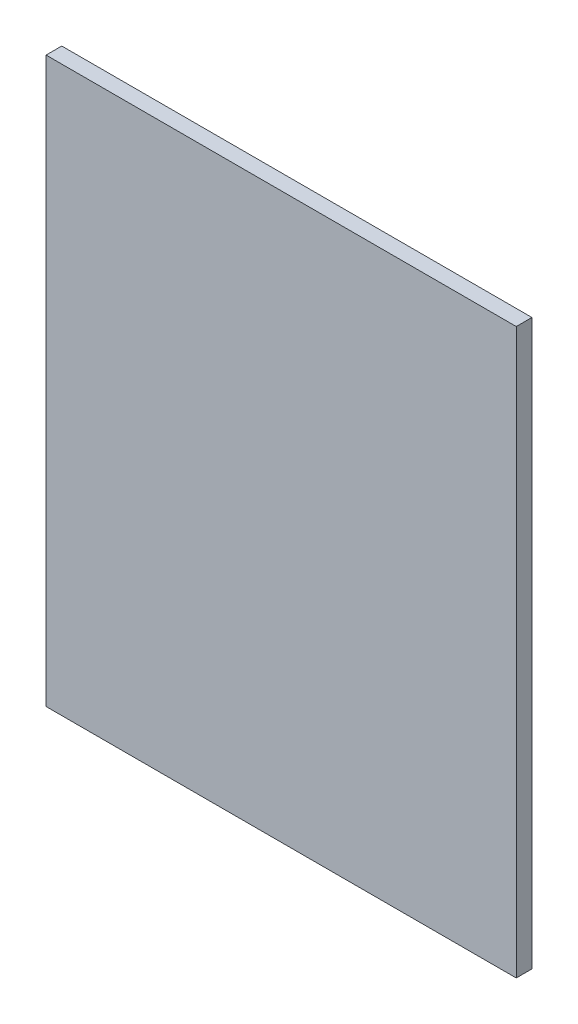
ISO-10303-21;
HEADER;
FILE_DESCRIPTION(('STEP AP214'),'2;1');
FILE_NAME('part.step','',(''),(''),'','','');
FILE_SCHEMA(('AUTOMOTIVE_DESIGN { 1 0 10303 214 1 1 1 1 }'));
ENDSEC;
DATA;
#1=APPLICATION_CONTEXT('core data for automotive mechanical design processes');
#2=APPLICATION_PROTOCOL_DEFINITION('international standard','automotive_design',2000,#1);
#3=PRODUCT_CONTEXT('',#1,'mechanical');
#4=PRODUCT('Part','Part','',(#3));
#5=PRODUCT_RELATED_PRODUCT_CATEGORY('part','',(#4));
#6=PRODUCT_DEFINITION_FORMATION('','',#4);
#7=PRODUCT_DEFINITION_CONTEXT('part definition',#1,'design');
#8=PRODUCT_DEFINITION('design','',#6,#7);
#9=PRODUCT_DEFINITION_SHAPE('','',#8);
#10=(LENGTH_UNIT() NAMED_UNIT(*) SI_UNIT(.MILLI.,.METRE.));
#11=(NAMED_UNIT(*) PLANE_ANGLE_UNIT() SI_UNIT($,.RADIAN.));
#12=(NAMED_UNIT(*) SI_UNIT($,.STERADIAN.) SOLID_ANGLE_UNIT());
#13=UNCERTAINTY_MEASURE_WITH_UNIT(LENGTH_MEASURE(1.E-05),#10,'distance_accuracy_value','');
#14=(GEOMETRIC_REPRESENTATION_CONTEXT(3) GLOBAL_UNCERTAINTY_ASSIGNED_CONTEXT((#13)) GLOBAL_UNIT_ASSIGNED_CONTEXT((#10,
#11,#12)) REPRESENTATION_CONTEXT('',''));
#15=CARTESIAN_POINT('',(0.,0.,0.));
#16=DIRECTION('',(0.,0.,1.));
#17=DIRECTION('',(1.,0.,0.));
#18=AXIS2_PLACEMENT_3D('',#15,#16,#17);
#19=CARTESIAN_POINT('',(150.,-180.,10.));
#20=DIRECTION('',(-1.,0.,0.));
#21=DIRECTION('',(0.,0.,1.));
#22=AXIS2_PLACEMENT_3D('',#19,#20,#21);
#23=PLANE('',#22);
#24=DIRECTION('',(0.,1.,0.));
#25=VECTOR('',#24,1.);
#26=CARTESIAN_POINT('',(150.,-180.,0.));
#27=LINE('',#26,#25);
#28=CARTESIAN_POINT('',(150.,-180.,0.));
#29=VERTEX_POINT('',#28);
#30=CARTESIAN_POINT('',(150.,180.,0.));
#31=VERTEX_POINT('',#30);
#32=EDGE_CURVE('E96',#29,#31,#27,.T.);
#33=ORIENTED_EDGE('',*,*,#32,.T.);
#34=DIRECTION('',(0.,0.,-1.));
#35=VECTOR('',#34,1.);
#36=CARTESIAN_POINT('',(150.,180.,10.));
#37=LINE('',#36,#35);
#38=CARTESIAN_POINT('',(150.,180.,10.));
#39=VERTEX_POINT('',#38);
#40=EDGE_CURVE('E11',#39,#31,#37,.T.);
#41=ORIENTED_EDGE('',*,*,#40,.F.);
#42=DIRECTION('',(0.,1.,0.));
#43=VECTOR('',#42,1.);
#44=CARTESIAN_POINT('',(150.,-180.,10.));
#45=LINE('',#44,#43);
#46=CARTESIAN_POINT('',(150.,-180.,10.));
#47=VERTEX_POINT('',#46);
#48=EDGE_CURVE('E84',#47,#39,#45,.T.);
#49=ORIENTED_EDGE('',*,*,#48,.F.);
#50=DIRECTION('',(0.,0.,-1.));
#51=VECTOR('',#50,1.);
#52=CARTESIAN_POINT('',(150.,-180.,10.));
#53=LINE('',#52,#51);
#54=EDGE_CURVE('E92',#47,#29,#53,.T.);
#55=ORIENTED_EDGE('',*,*,#54,.T.);
#56=EDGE_LOOP('',(#33,#41,#49,#55));
#57=FACE_BOUND('',#56,.T.);
#58=ADVANCED_FACE('F33',(#57),#23,.F.);
#59=CARTESIAN_POINT('',(-150.,180.,10.));
#60=DIRECTION('',(0.,-1.,0.));
#61=DIRECTION('',(0.,0.,-1.));
#62=AXIS2_PLACEMENT_3D('',#59,#60,#61);
#63=PLANE('',#62);
#64=DIRECTION('',(-1.,0.,0.));
#65=VECTOR('',#64,1.);
#66=CARTESIAN_POINT('',(-150.,180.,0.));
#67=LINE('',#66,#65);
#68=CARTESIAN_POINT('',(-150.,180.,0.));
#69=VERTEX_POINT('',#68);
#70=EDGE_CURVE('E88',#31,#69,#67,.T.);
#71=ORIENTED_EDGE('',*,*,#70,.T.);
#72=DIRECTION('',(0.,0.,-1.));
#73=VECTOR('',#72,1.);
#74=CARTESIAN_POINT('',(-150.,180.,10.));
#75=LINE('',#74,#73);
#76=CARTESIAN_POINT('',(-150.,180.,10.));
#77=VERTEX_POINT('',#76);
#78=EDGE_CURVE('E41',#77,#69,#75,.T.);
#79=ORIENTED_EDGE('',*,*,#78,.F.);
#80=DIRECTION('',(-1.,0.,0.));
#81=VECTOR('',#80,1.);
#82=CARTESIAN_POINT('',(-150.,180.,10.));
#83=LINE('',#82,#81);
#84=EDGE_CURVE('E79',#39,#77,#83,.T.);
#85=ORIENTED_EDGE('',*,*,#84,.F.);
#86=ORIENTED_EDGE('',*,*,#40,.T.);
#87=EDGE_LOOP('',(#71,#79,#85,#86));
#88=FACE_BOUND('',#87,.T.);
#89=ADVANCED_FACE('F87',(#88),#63,.F.);
#90=CARTESIAN_POINT('',(-150.,-180.,10.));
#91=DIRECTION('',(1.,0.,0.));
#92=DIRECTION('',(0.,0.,-1.));
#93=AXIS2_PLACEMENT_3D('',#90,#91,#92);
#94=PLANE('',#93);
#95=DIRECTION('',(0.,-1.,0.));
#96=VECTOR('',#95,1.);
#97=CARTESIAN_POINT('',(-150.,-180.,0.));
#98=LINE('',#97,#96);
#99=CARTESIAN_POINT('',(-150.,-180.,0.));
#100=VERTEX_POINT('',#99);
#101=EDGE_CURVE('E66',#69,#100,#98,.T.);
#102=ORIENTED_EDGE('',*,*,#101,.T.);
#103=DIRECTION('',(0.,0.,-1.));
#104=VECTOR('',#103,1.);
#105=CARTESIAN_POINT('',(-150.,-180.,10.));
#106=LINE('',#105,#104);
#107=CARTESIAN_POINT('',(-150.,-180.,10.));
#108=VERTEX_POINT('',#107);
#109=EDGE_CURVE('E89',#108,#100,#106,.T.);
#110=ORIENTED_EDGE('',*,*,#109,.F.);
#111=DIRECTION('',(0.,-1.,0.));
#112=VECTOR('',#111,1.);
#113=CARTESIAN_POINT('',(-150.,-180.,10.));
#114=LINE('',#113,#112);
#115=EDGE_CURVE('E82',#77,#108,#114,.T.);
#116=ORIENTED_EDGE('',*,*,#115,.F.);
#117=ORIENTED_EDGE('',*,*,#78,.T.);
#118=EDGE_LOOP('',(#102,#110,#116,#117));
#119=FACE_BOUND('',#118,.T.);
#120=ADVANCED_FACE('F90',(#119),#94,.F.);
#121=CARTESIAN_POINT('',(-150.,-180.,10.));
#122=DIRECTION('',(0.,1.,0.));
#123=DIRECTION('',(0.,0.,1.));
#124=AXIS2_PLACEMENT_3D('',#121,#122,#123);
#125=PLANE('',#124);
#126=DIRECTION('',(1.,0.,0.));
#127=VECTOR('',#126,1.);
#128=CARTESIAN_POINT('',(-150.,-180.,0.));
#129=LINE('',#128,#127);
#130=EDGE_CURVE('E72',#100,#29,#129,.T.);
#131=ORIENTED_EDGE('',*,*,#130,.T.);
#132=ORIENTED_EDGE('',*,*,#54,.F.);
#133=DIRECTION('',(1.,0.,0.));
#134=VECTOR('',#133,1.);
#135=CARTESIAN_POINT('',(-150.,-180.,10.));
#136=LINE('',#135,#134);
#137=EDGE_CURVE('E49',#108,#47,#136,.T.);
#138=ORIENTED_EDGE('',*,*,#137,.F.);
#139=ORIENTED_EDGE('',*,*,#109,.T.);
#140=EDGE_LOOP('',(#131,#132,#138,#139));
#141=FACE_BOUND('',#140,.T.);
#142=ADVANCED_FACE('F103',(#141),#125,.F.);
#143=CARTESIAN_POINT('',(0.,0.,10.));
#144=DIRECTION('',(0.,0.,-1.));
#145=DIRECTION('',(-1.,0.,0.));
#146=AXIS2_PLACEMENT_3D('',#143,#144,#145);
#147=PLANE('',#146);
#148=ORIENTED_EDGE('',*,*,#48,.T.);
#149=ORIENTED_EDGE('',*,*,#84,.T.);
#150=ORIENTED_EDGE('',*,*,#115,.T.);
#151=ORIENTED_EDGE('',*,*,#137,.T.);
#152=EDGE_LOOP('',(#148,#149,#150,#151));
#153=FACE_BOUND('',#152,.T.);
#154=ADVANCED_FACE('F80',(#153),#147,.F.);
#155=CARTESIAN_POINT('',(0.,0.,0.));
#156=DIRECTION('',(0.,0.,-1.));
#157=DIRECTION('',(-1.,0.,0.));
#158=AXIS2_PLACEMENT_3D('',#155,#156,#157);
#159=PLANE('',#158);
#160=ORIENTED_EDGE('',*,*,#32,.F.);
#161=ORIENTED_EDGE('',*,*,#130,.F.);
#162=ORIENTED_EDGE('',*,*,#101,.F.);
#163=ORIENTED_EDGE('',*,*,#70,.F.);
#164=EDGE_LOOP('',(#160,#161,#162,#163));
#165=FACE_BOUND('',#164,.T.);
#166=ADVANCED_FACE('F106',(#165),#159,.T.);
#167=CLOSED_SHELL('',(#58,#89,#120,#142,#154,#166));
#168=MANIFOLD_SOLID_BREP('B2',#167);
#169=ADVANCED_BREP_SHAPE_REPRESENTATION('',(#18,#168),#14);
#170=SHAPE_DEFINITION_REPRESENTATION(#9,#169);
ENDSEC;
END-ISO-10303-21;
